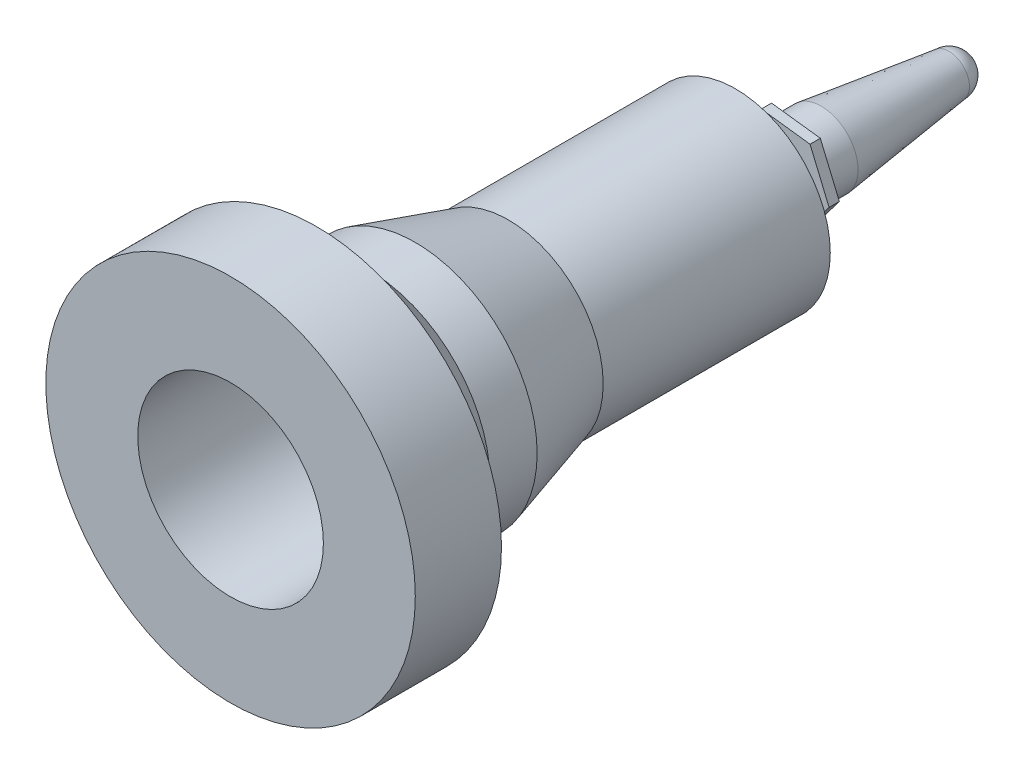
ISO-10303-21;
HEADER;
FILE_DESCRIPTION(('STEP AP214'),'2;1');
FILE_NAME('part.step','',(''),(''),'','','');
FILE_SCHEMA(('AUTOMOTIVE_DESIGN { 1 0 10303 214 1 1 1 1 }'));
ENDSEC;
DATA;
#1=APPLICATION_CONTEXT('core data for automotive mechanical design processes');
#2=APPLICATION_PROTOCOL_DEFINITION('international standard','automotive_design',2000,#1);
#3=PRODUCT_CONTEXT('',#1,'mechanical');
#4=PRODUCT('Part','Part','',(#3));
#5=PRODUCT_RELATED_PRODUCT_CATEGORY('part','',(#4));
#6=PRODUCT_DEFINITION_FORMATION('','',#4);
#7=PRODUCT_DEFINITION_CONTEXT('part definition',#1,'design');
#8=PRODUCT_DEFINITION('design','',#6,#7);
#9=PRODUCT_DEFINITION_SHAPE('','',#8);
#10=(LENGTH_UNIT() NAMED_UNIT(*) SI_UNIT(.MILLI.,.METRE.));
#11=(NAMED_UNIT(*) PLANE_ANGLE_UNIT() SI_UNIT($,.RADIAN.));
#12=(NAMED_UNIT(*) SI_UNIT($,.STERADIAN.) SOLID_ANGLE_UNIT());
#13=UNCERTAINTY_MEASURE_WITH_UNIT(LENGTH_MEASURE(1.E-05),#10,'distance_accuracy_value','');
#14=(GEOMETRIC_REPRESENTATION_CONTEXT(3) GLOBAL_UNCERTAINTY_ASSIGNED_CONTEXT((#13)) GLOBAL_UNIT_ASSIGNED_CONTEXT((#10,
#11,#12)) REPRESENTATION_CONTEXT('',''));
#15=CARTESIAN_POINT('',(0.,0.,0.));
#16=DIRECTION('',(0.,0.,1.));
#17=DIRECTION('',(1.,0.,0.));
#18=AXIS2_PLACEMENT_3D('',#15,#16,#17);
#19=CARTESIAN_POINT('',(0.,0.,0.));
#20=DIRECTION('',(0.,0.,1.));
#21=DIRECTION('',(1.,0.,0.));
#22=AXIS2_PLACEMENT_3D('',#19,#20,#21);
#23=CYLINDRICAL_SURFACE('',#22,118.736948210719);
#24=CARTESIAN_POINT('',(0.,0.,-134.));
#25=DIRECTION('',(0.,0.,1.));
#26=DIRECTION('',(1.,0.,0.));
#27=AXIS2_PLACEMENT_3D('',#24,#25,#26);
#28=CIRCLE('',#27,118.736948210719);
#29=CARTESIAN_POINT('',(118.736948210719,0.,-134.));
#30=VERTEX_POINT('',#29);
#31=EDGE_CURVE('E11',#30,#30,#28,.F.);
#32=ORIENTED_EDGE('',*,*,#31,.T.);
#33=EDGE_LOOP('',(#32));
#34=FACE_BOUND('',#33,.T.);
#35=CARTESIAN_POINT('',(0.,0.,-180.));
#36=DIRECTION('',(0.,0.,1.));
#37=DIRECTION('',(1.,0.,0.));
#38=AXIS2_PLACEMENT_3D('',#35,#36,#37);
#39=CIRCLE('',#38,118.736948210719);
#40=CARTESIAN_POINT('',(118.736948210719,0.,-180.));
#41=VERTEX_POINT('',#40);
#42=EDGE_CURVE('E140',#41,#41,#39,.T.);
#43=ORIENTED_EDGE('',*,*,#42,.T.);
#44=EDGE_LOOP('',(#43));
#45=FACE_BOUND('',#44,.T.);
#46=ADVANCED_FACE('F33',(#34,#45),#23,.T.);
#47=CARTESIAN_POINT('',(0.,0.,-700.));
#48=DIRECTION('',(0.,0.,1.));
#49=DIRECTION('',(0.,1.,0.));
#50=AXIS2_PLACEMENT_3D('',#47,#48,#49);
#51=SPHERICAL_SURFACE('',#50,20.);
#52=CARTESIAN_POINT('',(0.,0.,-700.));
#53=DIRECTION('',(0.,0.,1.));
#54=DIRECTION('',(1.,0.,0.));
#55=AXIS2_PLACEMENT_3D('',#52,#53,#54);
#56=CIRCLE('',#55,20.);
#57=CARTESIAN_POINT('',(20.,0.,-700.));
#58=VERTEX_POINT('',#57);
#59=EDGE_CURVE('E158',#58,#58,#56,.T.);
#60=ORIENTED_EDGE('',*,*,#59,.F.);
#61=EDGE_LOOP('',(#60));
#62=FACE_BOUND('',#61,.T.);
#63=CARTESIAN_POINT('',(0.,0.,-719.536134747038));
#64=DIRECTION('',(0.,0.,1.));
#65=DIRECTION('',(1.,0.,0.));
#66=AXIS2_PLACEMENT_3D('',#63,#64,#65);
#67=CIRCLE('',#66,4.28245713879006);
#68=CARTESIAN_POINT('',(4.28245713879006,0.,-719.536134747038));
#69=VERTEX_POINT('',#68);
#70=EDGE_CURVE('E123',#69,#69,#67,.F.);
#71=ORIENTED_EDGE('',*,*,#70,.F.);
#72=EDGE_LOOP('',(#71));
#73=FACE_BOUND('',#72,.T.);
#74=ADVANCED_FACE('F181',(#62,#73),#51,.T.);
#75=CARTESIAN_POINT('',(0.,0.,0.));
#76=DIRECTION('',(0.,0.,-1.));
#77=DIRECTION('',(-1.,0.,0.));
#78=AXIS2_PLACEMENT_3D('',#75,#76,#77);
#79=PLANE('',#78);
#80=CARTESIAN_POINT('',(0.,0.,0.));
#81=DIRECTION('',(0.,0.,1.));
#82=DIRECTION('',(1.,0.,0.));
#83=AXIS2_PLACEMENT_3D('',#80,#81,#82);
#84=CIRCLE('',#83,90.4479858363972);
#85=CARTESIAN_POINT('',(90.4479858363972,0.,0.));
#86=VERTEX_POINT('',#85);
#87=EDGE_CURVE('E164',#86,#86,#84,.T.);
#88=ORIENTED_EDGE('',*,*,#87,.F.);
#89=EDGE_LOOP('',(#88));
#90=FACE_BOUND('',#89,.T.);
#91=CARTESIAN_POINT('',(0.,0.,0.));
#92=DIRECTION('',(0.,0.,1.));
#93=DIRECTION('',(1.,0.,0.));
#94=AXIS2_PLACEMENT_3D('',#91,#92,#93);
#95=CIRCLE('',#94,180.);
#96=CARTESIAN_POINT('',(180.,0.,0.));
#97=VERTEX_POINT('',#96);
#98=EDGE_CURVE('E229',#97,#97,#95,.T.);
#99=ORIENTED_EDGE('',*,*,#98,.T.);
#100=EDGE_LOOP('',(#99));
#101=FACE_BOUND('',#100,.T.);
#102=ADVANCED_FACE('F187',(#90,#101),#79,.F.);
#103=CARTESIAN_POINT('',(0.,0.,0.));
#104=DIRECTION('',(0.,0.,1.));
#105=DIRECTION('',(1.,0.,0.));
#106=AXIS2_PLACEMENT_3D('',#103,#104,#105);
#107=CYLINDRICAL_SURFACE('',#106,24.);
#108=CARTESIAN_POINT('',(0.,0.,-535.741946393258));
#109=DIRECTION('',(0.,0.,1.));
#110=DIRECTION('',(1.,0.,0.));
#111=AXIS2_PLACEMENT_3D('',#108,#109,#110);
#112=CIRCLE('',#111,24.);
#113=CARTESIAN_POINT('',(24.,0.,-535.741946393258));
#114=VERTEX_POINT('',#113);
#115=EDGE_CURVE('E139',#114,#114,#112,.T.);
#116=ORIENTED_EDGE('',*,*,#115,.T.);
#117=EDGE_LOOP('',(#116));
#118=FACE_BOUND('',#117,.T.);
#119=CARTESIAN_POINT('',(0.,0.,-492.));
#120=DIRECTION('',(0.,0.,1.));
#121=DIRECTION('',(1.,0.,0.));
#122=AXIS2_PLACEMENT_3D('',#119,#120,#121);
#123=CIRCLE('',#122,24.);
#124=CARTESIAN_POINT('',(24.,0.,-492.));
#125=VERTEX_POINT('',#124);
#126=EDGE_CURVE('E149',#125,#125,#123,.T.);
#127=ORIENTED_EDGE('',*,*,#126,.F.);
#128=EDGE_LOOP('',(#127));
#129=FACE_BOUND('',#128,.T.);
#130=ADVANCED_FACE('F206',(#118,#129),#107,.T.);
#131=CARTESIAN_POINT('',(0.,24.,-492.));
#132=DIRECTION('',(0.,0.,1.));
#133=DIRECTION('',(1.,0.,0.));
#134=AXIS2_PLACEMENT_3D('',#131,#132,#133);
#135=PLANE('',#134);
#136=CARTESIAN_POINT('',(0.,0.,-492.));
#137=DIRECTION('',(0.,0.,1.));
#138=DIRECTION('',(1.,0.,0.));
#139=AXIS2_PLACEMENT_3D('',#136,#137,#138);
#140=CIRCLE('',#139,92.3509597194478);
#141=CARTESIAN_POINT('',(92.3509597194478,0.,-492.));
#142=VERTEX_POINT('',#141);
#143=EDGE_CURVE('E146',#142,#142,#140,.T.);
#144=ORIENTED_EDGE('',*,*,#143,.F.);
#145=EDGE_LOOP('',(#144));
#146=FACE_BOUND('',#145,.T.);
#147=ORIENTED_EDGE('',*,*,#126,.T.);
#148=EDGE_LOOP('',(#147));
#149=FACE_BOUND('',#148,.T.);
#150=ADVANCED_FACE('F202',(#146,#149),#135,.F.);
#151=CARTESIAN_POINT('',(0.,0.,0.));
#152=DIRECTION('',(0.,0.,1.));
#153=DIRECTION('',(1.,0.,0.));
#154=AXIS2_PLACEMENT_3D('',#151,#152,#153);
#155=CYLINDRICAL_SURFACE('',#154,92.3509597194478);
#156=CARTESIAN_POINT('',(0.,0.,-270.7367084028));
#157=DIRECTION('',(0.,0.,1.));
#158=DIRECTION('',(1.,0.,0.));
#159=AXIS2_PLACEMENT_3D('',#156,#157,#158);
#160=CIRCLE('',#159,92.3509597194478);
#161=CARTESIAN_POINT('',(92.3509597194478,0.,-270.7367084028));
#162=VERTEX_POINT('',#161);
#163=EDGE_CURVE('E143',#162,#162,#160,.T.);
#164=ORIENTED_EDGE('',*,*,#163,.F.);
#165=EDGE_LOOP('',(#164));
#166=FACE_BOUND('',#165,.T.);
#167=ORIENTED_EDGE('',*,*,#143,.T.);
#168=EDGE_LOOP('',(#167));
#169=FACE_BOUND('',#168,.T.);
#170=ADVANCED_FACE('F198',(#166,#169),#155,.T.);
#171=CARTESIAN_POINT('',(0.,0.,-270.7367084028));
#172=DIRECTION('',(0.,0.,1.));
#173=DIRECTION('',(1.,0.,0.));
#174=AXIS2_PLACEMENT_3D('',#171,#172,#173);
#175=CONICAL_SURFACE('',#174,92.3509597194478,0.282992700339821);
#176=ORIENTED_EDGE('',*,*,#42,.F.);
#177=EDGE_LOOP('',(#176));
#178=FACE_BOUND('',#177,.T.);
#179=ORIENTED_EDGE('',*,*,#163,.T.);
#180=EDGE_LOOP('',(#179));
#181=FACE_BOUND('',#180,.T.);
#182=ADVANCED_FACE('F195',(#178,#181),#175,.T.);
#183=CARTESIAN_POINT('',(18.5811043039227,-44.0761815550295,-535.741946393258));
#184=DIRECTION('',(-0.797149207528996,0.603782362226567,0.));
#185=DIRECTION('',(-0.603782362226567,-0.797149207528996,0.));
#186=AXIS2_PLACEMENT_3D('',#183,#184,#185);
#187=PLANE('',#186);
#188=DIRECTION('',(0.603782362226567,0.797149207528996,0.));
#189=VECTOR('',#188,1.);
#190=CARTESIAN_POINT('',(18.5811043039227,-44.0761815550295,-545.741946393258));
#191=LINE('',#190,#189);
#192=CARTESIAN_POINT('',(18.5811043039227,-44.0761815550295,-545.741946393258));
#193=VERTEX_POINT('',#192);
#194=CARTESIAN_POINT('',(47.4616450804319,-5.9463824199493,-545.741946393258));
#195=VERTEX_POINT('',#194);
#196=EDGE_CURVE('E119',#193,#195,#191,.T.);
#197=ORIENTED_EDGE('',*,*,#196,.T.);
#198=DIRECTION('',(0.,0.,-1.));
#199=VECTOR('',#198,1.);
#200=CARTESIAN_POINT('',(47.4616450804319,-5.9463824199493,-535.741946393258));
#201=LINE('',#200,#199);
#202=CARTESIAN_POINT('',(47.4616450804319,-5.9463824199493,-535.741946393258));
#203=VERTEX_POINT('',#202);
#204=EDGE_CURVE('E137',#203,#195,#201,.T.);
#205=ORIENTED_EDGE('',*,*,#204,.F.);
#206=DIRECTION('',(0.603782362226567,0.797149207528996,0.));
#207=VECTOR('',#206,1.);
#208=CARTESIAN_POINT('',(18.5811043039227,-44.0761815550295,-535.741946393258));
#209=LINE('',#208,#207);
#210=CARTESIAN_POINT('',(18.5811043039227,-44.0761815550295,-535.741946393258));
#211=VERTEX_POINT('',#210);
#212=EDGE_CURVE('E130',#211,#203,#209,.T.);
#213=ORIENTED_EDGE('',*,*,#212,.F.);
#214=DIRECTION('',(0.,0.,-1.));
#215=VECTOR('',#214,1.);
#216=CARTESIAN_POINT('',(18.5811043039227,-44.0761815550295,-535.741946393258));
#217=LINE('',#216,#215);
#218=EDGE_CURVE('E115',#211,#193,#217,.T.);
#219=ORIENTED_EDGE('',*,*,#218,.T.);
#220=EDGE_LOOP('',(#197,#205,#213,#219));
#221=FACE_BOUND('',#220,.T.);
#222=ADVANCED_FACE('F193',(#221),#187,.F.);
#223=CARTESIAN_POINT('',(47.4616450804319,-5.9463824199493,-535.741946393258));
#224=DIRECTION('',(-0.921465467809683,-0.38846028321346,0.));
#225=DIRECTION('',(0.38846028321346,-0.921465467809683,0.));
#226=AXIS2_PLACEMENT_3D('',#223,#224,#225);
#227=PLANE('',#226);
#228=DIRECTION('',(-0.38846028321346,0.921465467809683,0.));
#229=VECTOR('',#228,1.);
#230=CARTESIAN_POINT('',(47.4616450804319,-5.9463824199493,-545.741946393258));
#231=LINE('',#230,#229);
#232=CARTESIAN_POINT('',(28.8805407765093,38.1297991350802,-545.741946393258));
#233=VERTEX_POINT('',#232);
#234=EDGE_CURVE('E122',#195,#233,#231,.T.);
#235=ORIENTED_EDGE('',*,*,#234,.T.);
#236=DIRECTION('',(0.,0.,-1.));
#237=VECTOR('',#236,1.);
#238=CARTESIAN_POINT('',(28.8805407765093,38.1297991350802,-535.741946393258));
#239=LINE('',#238,#237);
#240=CARTESIAN_POINT('',(28.8805407765093,38.1297991350802,-535.741946393258));
#241=VERTEX_POINT('',#240);
#242=EDGE_CURVE('E134',#241,#233,#239,.T.);
#243=ORIENTED_EDGE('',*,*,#242,.F.);
#244=DIRECTION('',(-0.38846028321346,0.921465467809683,0.));
#245=VECTOR('',#244,1.);
#246=CARTESIAN_POINT('',(47.4616450804319,-5.9463824199493,-535.741946393258));
#247=LINE('',#246,#245);
#248=EDGE_CURVE('E88',#203,#241,#247,.T.);
#249=ORIENTED_EDGE('',*,*,#248,.F.);
#250=ORIENTED_EDGE('',*,*,#204,.T.);
#251=EDGE_LOOP('',(#235,#243,#249,#250));
#252=FACE_BOUND('',#251,.T.);
#253=ADVANCED_FACE('F255',(#252),#227,.F.);
#254=CARTESIAN_POINT('',(28.8805407765093,38.1297991350802,-535.741946393258));
#255=DIRECTION('',(-0.124316260280687,-0.992242645440028,0.));
#256=DIRECTION('',(0.992242645440028,-0.124316260280688,0.));
#257=AXIS2_PLACEMENT_3D('',#254,#255,#256);
#258=PLANE('',#257);
#259=DIRECTION('',(-0.992242645440028,0.124316260280687,0.));
#260=VECTOR('',#259,1.);
#261=CARTESIAN_POINT('',(28.8805407765093,38.1297991350802,-545.741946393258));
#262=LINE('',#261,#260);
#263=CARTESIAN_POINT('',(-18.5811043039227,44.0761815550295,-545.741946393258));
#264=VERTEX_POINT('',#263);
#265=EDGE_CURVE('E125',#233,#264,#262,.T.);
#266=ORIENTED_EDGE('',*,*,#265,.T.);
#267=DIRECTION('',(0.,0.,-1.));
#268=VECTOR('',#267,1.);
#269=CARTESIAN_POINT('',(-18.5811043039227,44.0761815550295,-535.741946393258));
#270=LINE('',#269,#268);
#271=CARTESIAN_POINT('',(-18.5811043039227,44.0761815550295,-535.741946393258));
#272=VERTEX_POINT('',#271);
#273=EDGE_CURVE('E110',#272,#264,#270,.T.);
#274=ORIENTED_EDGE('',*,*,#273,.F.);
#275=DIRECTION('',(-0.992242645440028,0.124316260280687,0.));
#276=VECTOR('',#275,1.);
#277=CARTESIAN_POINT('',(28.8805407765093,38.1297991350802,-535.741946393258));
#278=LINE('',#277,#276);
#279=EDGE_CURVE('E101',#241,#272,#278,.T.);
#280=ORIENTED_EDGE('',*,*,#279,.F.);
#281=ORIENTED_EDGE('',*,*,#242,.T.);
#282=EDGE_LOOP('',(#266,#274,#280,#281));
#283=FACE_BOUND('',#282,.T.);
#284=ADVANCED_FACE('F258',(#283),#258,.F.);
#285=CARTESIAN_POINT('',(-18.5811043039227,44.0761815550295,-535.741946393258));
#286=DIRECTION('',(0.797149207528996,-0.603782362226568,0.));
#287=DIRECTION('',(0.603782362226568,0.797149207528996,0.));
#288=AXIS2_PLACEMENT_3D('',#285,#286,#287);
#289=PLANE('',#288);
#290=DIRECTION('',(-0.603782362226568,-0.797149207528996,0.));
#291=VECTOR('',#290,1.);
#292=CARTESIAN_POINT('',(-18.5811043039227,44.0761815550295,-545.741946393258));
#293=LINE('',#292,#291);
#294=CARTESIAN_POINT('',(-47.4616450804319,5.94638241994932,-545.741946393258));
#295=VERTEX_POINT('',#294);
#296=EDGE_CURVE('E109',#264,#295,#293,.T.);
#297=ORIENTED_EDGE('',*,*,#296,.T.);
#298=DIRECTION('',(0.,0.,-1.));
#299=VECTOR('',#298,1.);
#300=CARTESIAN_POINT('',(-47.4616450804319,5.94638241994932,-535.741946393258));
#301=LINE('',#300,#299);
#302=CARTESIAN_POINT('',(-47.4616450804319,5.94638241994932,-535.741946393258));
#303=VERTEX_POINT('',#302);
#304=EDGE_CURVE('E106',#303,#295,#301,.T.);
#305=ORIENTED_EDGE('',*,*,#304,.F.);
#306=DIRECTION('',(-0.603782362226568,-0.797149207528996,0.));
#307=VECTOR('',#306,1.);
#308=CARTESIAN_POINT('',(-18.5811043039227,44.0761815550295,-535.741946393258));
#309=LINE('',#308,#307);
#310=EDGE_CURVE('E95',#272,#303,#309,.T.);
#311=ORIENTED_EDGE('',*,*,#310,.F.);
#312=ORIENTED_EDGE('',*,*,#273,.T.);
#313=EDGE_LOOP('',(#297,#305,#311,#312));
#314=FACE_BOUND('',#313,.T.);
#315=ADVANCED_FACE('F107',(#314),#289,.F.);
#316=CARTESIAN_POINT('',(-47.4616450804319,5.94638241994932,-535.741946393258));
#317=DIRECTION('',(0.921465467809683,0.38846028321346,0.));
#318=DIRECTION('',(-0.38846028321346,0.921465467809683,0.));
#319=AXIS2_PLACEMENT_3D('',#316,#317,#318);
#320=PLANE('',#319);
#321=DIRECTION('',(0.38846028321346,-0.921465467809683,0.));
#322=VECTOR('',#321,1.);
#323=CARTESIAN_POINT('',(-47.4616450804319,5.94638241994932,-545.741946393258));
#324=LINE('',#323,#322);
#325=CARTESIAN_POINT('',(-28.8805407765093,-38.1297991350801,-545.741946393258));
#326=VERTEX_POINT('',#325);
#327=EDGE_CURVE('E73',#295,#326,#324,.T.);
#328=ORIENTED_EDGE('',*,*,#327,.T.);
#329=DIRECTION('',(0.,0.,-1.));
#330=VECTOR('',#329,1.);
#331=CARTESIAN_POINT('',(-28.8805407765093,-38.1297991350801,-535.741946393258));
#332=LINE('',#331,#330);
#333=CARTESIAN_POINT('',(-28.8805407765093,-38.1297991350801,-535.741946393258));
#334=VERTEX_POINT('',#333);
#335=EDGE_CURVE('E111',#334,#326,#332,.T.);
#336=ORIENTED_EDGE('',*,*,#335,.F.);
#337=DIRECTION('',(0.38846028321346,-0.921465467809683,0.));
#338=VECTOR('',#337,1.);
#339=CARTESIAN_POINT('',(-47.4616450804319,5.94638241994932,-535.741946393258));
#340=LINE('',#339,#338);
#341=EDGE_CURVE('E99',#303,#334,#340,.T.);
#342=ORIENTED_EDGE('',*,*,#341,.F.);
#343=ORIENTED_EDGE('',*,*,#304,.T.);
#344=EDGE_LOOP('',(#328,#336,#342,#343));
#345=FACE_BOUND('',#344,.T.);
#346=ADVANCED_FACE('F113',(#345),#320,.F.);
#347=CARTESIAN_POINT('',(-28.8805407765093,-38.1297991350801,-535.741946393258));
#348=DIRECTION('',(0.124316260280688,0.992242645440028,0.));
#349=DIRECTION('',(-0.992242645440028,0.124316260280688,0.));
#350=AXIS2_PLACEMENT_3D('',#347,#348,#349);
#351=PLANE('',#350);
#352=DIRECTION('',(0.992242645440027,-0.124316260280688,0.));
#353=VECTOR('',#352,1.);
#354=CARTESIAN_POINT('',(-28.8805407765093,-38.1297991350801,-545.741946393258));
#355=LINE('',#354,#353);
#356=EDGE_CURVE('E79',#326,#193,#355,.T.);
#357=ORIENTED_EDGE('',*,*,#356,.T.);
#358=ORIENTED_EDGE('',*,*,#218,.F.);
#359=DIRECTION('',(0.992242645440027,-0.124316260280688,0.));
#360=VECTOR('',#359,1.);
#361=CARTESIAN_POINT('',(-28.8805407765093,-38.1297991350801,-535.741946393258));
#362=LINE('',#361,#360);
#363=EDGE_CURVE('E50',#334,#211,#362,.T.);
#364=ORIENTED_EDGE('',*,*,#363,.F.);
#365=ORIENTED_EDGE('',*,*,#335,.T.);
#366=EDGE_LOOP('',(#357,#358,#364,#365));
#367=FACE_BOUND('',#366,.T.);
#368=ADVANCED_FACE('F262',(#367),#351,.F.);
#369=CARTESIAN_POINT('',(0.,0.,-535.741946393258));
#370=DIRECTION('',(0.,0.,1.));
#371=DIRECTION('',(1.,0.,0.));
#372=AXIS2_PLACEMENT_3D('',#369,#370,#371);
#373=PLANE('',#372);
#374=ORIENTED_EDGE('',*,*,#115,.F.);
#375=EDGE_LOOP('',(#374));
#376=FACE_BOUND('',#375,.T.);
#377=ORIENTED_EDGE('',*,*,#212,.T.);
#378=ORIENTED_EDGE('',*,*,#248,.T.);
#379=ORIENTED_EDGE('',*,*,#279,.T.);
#380=ORIENTED_EDGE('',*,*,#310,.T.);
#381=ORIENTED_EDGE('',*,*,#341,.T.);
#382=ORIENTED_EDGE('',*,*,#363,.T.);
#383=EDGE_LOOP('',(#377,#378,#379,#380,#381,#382));
#384=FACE_BOUND('',#383,.T.);
#385=ADVANCED_FACE('F97',(#376,#384),#373,.T.);
#386=CARTESIAN_POINT('',(0.,0.,-545.741946393258));
#387=DIRECTION('',(0.,0.,1.));
#388=DIRECTION('',(1.,0.,0.));
#389=AXIS2_PLACEMENT_3D('',#386,#387,#388);
#390=PLANE('',#389);
#391=CARTESIAN_POINT('',(0.,0.,-545.741946393258));
#392=DIRECTION('',(0.,0.,1.));
#393=DIRECTION('',(1.,0.,0.));
#394=AXIS2_PLACEMENT_3D('',#391,#392,#393);
#395=CIRCLE('',#394,35.8894796090416);
#396=CARTESIAN_POINT('',(35.8894796090416,0.,-545.741946393258));
#397=VERTEX_POINT('',#396);
#398=EDGE_CURVE('E152',#397,#397,#395,.T.);
#399=ORIENTED_EDGE('',*,*,#398,.T.);
#400=EDGE_LOOP('',(#399));
#401=FACE_BOUND('',#400,.T.);
#402=ORIENTED_EDGE('',*,*,#196,.F.);
#403=ORIENTED_EDGE('',*,*,#356,.F.);
#404=ORIENTED_EDGE('',*,*,#327,.F.);
#405=ORIENTED_EDGE('',*,*,#296,.F.);
#406=ORIENTED_EDGE('',*,*,#265,.F.);
#407=ORIENTED_EDGE('',*,*,#234,.F.);
#408=EDGE_LOOP('',(#402,#403,#404,#405,#406,#407));
#409=FACE_BOUND('',#408,.T.);
#410=ADVANCED_FACE('F218',(#401,#409),#390,.F.);
#411=CARTESIAN_POINT('',(0.,0.,-700.));
#412=DIRECTION('',(0.,0.,1.));
#413=DIRECTION('',(1.,0.,0.));
#414=AXIS2_PLACEMENT_3D('',#411,#412,#413);
#415=CONICAL_SURFACE('',#414,20.,0.126950737295993);
#416=CARTESIAN_POINT('',(0.,0.,-575.510554629339));
#417=DIRECTION('',(0.,0.,1.));
#418=DIRECTION('',(1.,0.,0.));
#419=AXIS2_PLACEMENT_3D('',#416,#417,#418);
#420=CIRCLE('',#419,35.8894796090416);
#421=CARTESIAN_POINT('',(35.8894796090416,0.,-575.510554629339));
#422=VERTEX_POINT('',#421);
#423=EDGE_CURVE('E155',#422,#422,#420,.T.);
#424=ORIENTED_EDGE('',*,*,#423,.F.);
#425=EDGE_LOOP('',(#424));
#426=FACE_BOUND('',#425,.T.);
#427=ORIENTED_EDGE('',*,*,#59,.T.);
#428=EDGE_LOOP('',(#427));
#429=FACE_BOUND('',#428,.T.);
#430=ADVANCED_FACE('F215',(#426,#429),#415,.T.);
#431=CARTESIAN_POINT('',(0.,0.,0.));
#432=DIRECTION('',(0.,0.,1.));
#433=DIRECTION('',(1.,0.,0.));
#434=AXIS2_PLACEMENT_3D('',#431,#432,#433);
#435=CYLINDRICAL_SURFACE('',#434,35.8894796090416);
#436=ORIENTED_EDGE('',*,*,#398,.F.);
#437=EDGE_LOOP('',(#436));
#438=FACE_BOUND('',#437,.T.);
#439=ORIENTED_EDGE('',*,*,#423,.T.);
#440=EDGE_LOOP('',(#439));
#441=FACE_BOUND('',#440,.T.);
#442=ADVANCED_FACE('F211',(#438,#441),#435,.T.);
#443=CARTESIAN_POINT('',(0.,0.,-720.));
#444=DIRECTION('',(0.,0.,1.));
#445=DIRECTION('',(1.,0.,0.));
#446=AXIS2_PLACEMENT_3D('',#443,#444,#445);
#447=CONICAL_SURFACE('',#446,4.24350932983724,0.0837671457035132);
#448=CARTESIAN_POINT('',(0.,0.,-575.510554629339));
#449=DIRECTION('',(0.,0.,1.));
#450=DIRECTION('',(1.,0.,0.));
#451=AXIS2_PLACEMENT_3D('',#448,#449,#450);
#452=CIRCLE('',#451,16.3753671873944);
#453=CARTESIAN_POINT('',(16.3753671873944,0.,-575.510554629339));
#454=VERTEX_POINT('',#453);
#455=EDGE_CURVE('E234',#454,#454,#452,.T.);
#456=CARTESIAN_POINT('',(16.3753671873944,0.,-575.510554629339));
#457=CARTESIAN_POINT('',(16.2493993743881,0.,-577.010821088898));
#458=CARTESIAN_POINT('',(16.1234315613818,0.,-578.511087548458));
#459=CARTESIAN_POINT('',(15.8714959353692,0.,-581.511620467576));
#460=CARTESIAN_POINT('',(15.7455281223629,0.,-583.011886927136));
#461=CARTESIAN_POINT('',(15.4935924963504,0.,-586.012419846254));
#462=CARTESIAN_POINT('',(15.3676246833441,0.,-587.512686305814));
#463=CARTESIAN_POINT('',(15.1156890573315,0.,-590.513219224933));
#464=CARTESIAN_POINT('',(14.9897212443252,0.,-592.013485684492));
#465=CARTESIAN_POINT('',(14.7377856183126,0.,-595.014018603611));
#466=CARTESIAN_POINT('',(14.6118178053063,0.,-596.51428506317));
#467=CARTESIAN_POINT('',(14.3598821792937,0.,-599.514817982289));
#468=CARTESIAN_POINT('',(14.2339143662874,0.,-601.015084441848));
#469=CARTESIAN_POINT('',(13.9819787402748,0.,-604.015617360967));
#470=CARTESIAN_POINT('',(13.8560109272685,0.,-605.515883820526));
#471=CARTESIAN_POINT('',(13.6040753012559,0.,-608.516416739645));
#472=CARTESIAN_POINT('',(13.4781074882496,0.,-610.016683199204));
#473=CARTESIAN_POINT('',(13.226171862237,0.,-613.017216118323));
#474=CARTESIAN_POINT('',(13.1002040492307,0.,-614.517482577882));
#475=CARTESIAN_POINT('',(12.8482684232181,0.,-617.518015497001));
#476=CARTESIAN_POINT('',(12.7223006102118,0.,-619.01828195656));
#477=CARTESIAN_POINT('',(12.4703649841993,0.,-622.018814875679));
#478=CARTESIAN_POINT('',(12.344397171193,0.,-623.519081335239));
#479=CARTESIAN_POINT('',(12.0924615451804,0.,-626.519614254357));
#480=CARTESIAN_POINT('',(11.9664937321741,0.,-628.019880713917));
#481=CARTESIAN_POINT('',(11.7145581061615,0.,-631.020413633035));
#482=CARTESIAN_POINT('',(11.5885902931552,0.,-632.520680092595));
#483=CARTESIAN_POINT('',(11.3366546671426,0.,-635.521213011713));
#484=CARTESIAN_POINT('',(11.2106868541363,0.,-637.021479471273));
#485=CARTESIAN_POINT('',(10.9587512281237,0.,-640.022012390392));
#486=CARTESIAN_POINT('',(10.8327834151174,0.,-641.522278849951));
#487=CARTESIAN_POINT('',(10.5808477891048,0.,-644.52281176907));
#488=CARTESIAN_POINT('',(10.4548799760985,0.,-646.023078228629));
#489=CARTESIAN_POINT('',(10.2029443500859,0.,-649.023611147748));
#490=CARTESIAN_POINT('',(10.0769765370796,0.,-650.523877607307));
#491=CARTESIAN_POINT('',(9.82504091106706,0.,-653.524410526426));
#492=CARTESIAN_POINT('',(9.69907309806076,0.,-655.024676985985));
#493=CARTESIAN_POINT('',(9.44713747204817,0.,-658.025209905104));
#494=CARTESIAN_POINT('',(9.32116965904187,0.,-659.525476364663));
#495=CARTESIAN_POINT('',(9.06923403302928,0.,-662.526009283782));
#496=CARTESIAN_POINT('',(8.94326622002299,0.,-664.026275743341));
#497=CARTESIAN_POINT('',(8.6913305940104,0.,-667.02680866246));
#498=CARTESIAN_POINT('',(8.5653627810041,0.,-668.52707512202));
#499=CARTESIAN_POINT('',(8.31342715499151,0.,-671.527608041138));
#500=CARTESIAN_POINT('',(8.18745934198522,0.,-673.027874500698));
#501=CARTESIAN_POINT('',(7.93552371597263,0.,-676.028407419816));
#502=CARTESIAN_POINT('',(7.80955590296633,0.,-677.528673879376));
#503=CARTESIAN_POINT('',(7.55762027695374,0.,-680.529206798494));
#504=CARTESIAN_POINT('',(7.43165246394744,0.,-682.029473258054));
#505=CARTESIAN_POINT('',(7.17971683793485,0.,-685.030006177173));
#506=CARTESIAN_POINT('',(7.05374902492856,0.,-686.530272636732));
#507=CARTESIAN_POINT('',(6.80181339891597,0.,-689.530805555851));
#508=CARTESIAN_POINT('',(6.67584558590967,0.,-691.03107201541));
#509=CARTESIAN_POINT('',(6.42390995989708,0.,-694.031604934529));
#510=CARTESIAN_POINT('',(6.29794214689078,0.,-695.531871394088));
#511=CARTESIAN_POINT('',(6.04600652087819,0.,-698.532404313207));
#512=CARTESIAN_POINT('',(5.9200387078719,0.,-700.032670772766));
#513=CARTESIAN_POINT('',(5.66810308185931,0.,-703.033203691885));
#514=CARTESIAN_POINT('',(5.54213526885301,0.,-704.533470151444));
#515=CARTESIAN_POINT('',(5.29019964284042,0.,-707.534003070563));
#516=CARTESIAN_POINT('',(5.16423182983412,0.,-709.034269530122));
#517=CARTESIAN_POINT('',(4.91229620382153,0.,-712.034802449241));
#518=CARTESIAN_POINT('',(4.78632839081524,0.,-713.5350689088));
#519=CARTESIAN_POINT('',(4.53439276480265,0.,-716.535601827919));
#520=CARTESIAN_POINT('',(4.40842495179635,0.,-718.035868287479));
#521=CARTESIAN_POINT('',(4.28245713879006,0.,-719.536134747038));
#522=B_SPLINE_CURVE_WITH_KNOTS('',3,(#456,#457,#458,#459,#460,#461,#462,#463,#464,#465,#466,
#467,#468,#469,#470,#471,#472,#473,#474,#475,#476,#477,#478,#479,#480,#481,#482,#483,#484,#485,
#486,#487,#488,#489,#490,#491,#492,#493,#494,#495,#496,#497,#498,#499,#500,#501,#502,#503,#504,
#505,#506,#507,#508,#509,#510,#511,#512,#513,#514,#515,#516,#517,#518,#519,#520,#521),
.UNSPECIFIED.,.F.,.F.,(4,2,2,2,2,2,2,2,2,2,2,2,2,2,2,2,2,2,2,2,2,2,2,2,2,2,2,2,2,2,2,2,4),(0.,
4.51663658670159,9.03327317340318,13.5499097601049,18.0665463468065,22.583182933508,
27.0998195202096,31.6164561069112,36.1330926936128,40.6497292803144,45.166365867016,
49.6830024537176,54.1996390404192,58.7162756271208,63.2329122138223,67.749548800524,
72.2661853872256,76.7828219739272,81.2994585606288,85.8160951473304,90.332731734032,
94.8493683207336,99.3660049074352,103.882641494137,108.399278080838,112.91591466754,
117.432551254242,121.949187840943,126.465824427645,130.982461014346,135.499097601048,
140.01573418775,144.532370774451),.UNSPECIFIED.);
#523=EDGE_CURVE('BSEAM214',#454,#69,#522,.T.);
#524=ORIENTED_EDGE('',*,*,#455,.T.);
#525=ORIENTED_EDGE('',*,*,#70,.T.);
#526=ORIENTED_EDGE('',*,*,#523,.T.);
#527=ORIENTED_EDGE('',*,*,#523,.F.);
#528=EDGE_LOOP('',(#524,#526,#525,#527));
#529=FACE_BOUND('',#528,.T.);
#530=ADVANCED_FACE('F214',(#529),#447,.F.);
#531=CARTESIAN_POINT('',(0.,0.,0.));
#532=DIRECTION('',(0.,0.,1.));
#533=DIRECTION('',(1.,0.,0.));
#534=AXIS2_PLACEMENT_3D('',#531,#532,#533);
#535=CYLINDRICAL_SURFACE('',#534,90.4479858363972);
#536=ORIENTED_EDGE('',*,*,#87,.T.);
#537=EDGE_LOOP('',(#536));
#538=FACE_BOUND('',#537,.T.);
#539=CARTESIAN_POINT('',(0.,0.,-179.731042443091));
#540=DIRECTION('',(0.,0.,1.));
#541=DIRECTION('',(1.,0.,0.));
#542=AXIS2_PLACEMENT_3D('',#539,#540,#541);
#543=CIRCLE('',#542,90.4479858363973);
#544=CARTESIAN_POINT('',(90.4479858363973,0.,-179.731042443091));
#545=VERTEX_POINT('',#544);
#546=EDGE_CURVE('E248',#545,#545,#543,.T.);
#547=ORIENTED_EDGE('',*,*,#546,.F.);
#548=EDGE_LOOP('',(#547));
#549=FACE_BOUND('',#548,.T.);
#550=ADVANCED_FACE('F362',(#538,#549),#535,.F.);
#551=CARTESIAN_POINT('',(0.,0.,-270.7367084028));
#552=DIRECTION('',(0.,0.,1.));
#553=DIRECTION('',(1.,0.,0.));
#554=AXIS2_PLACEMENT_3D('',#551,#552,#553);
#555=CONICAL_SURFACE('',#554,69.2454690721239,0.228896991670563);
#556=ORIENTED_EDGE('',*,*,#546,.T.);
#557=EDGE_LOOP('',(#556));
#558=FACE_BOUND('',#557,.T.);
#559=CARTESIAN_POINT('',(0.,0.,-270.7367084028));
#560=DIRECTION('',(0.,0.,1.));
#561=DIRECTION('',(1.,0.,0.));
#562=AXIS2_PLACEMENT_3D('',#559,#560,#561);
#563=CIRCLE('',#562,69.2454690721239);
#564=CARTESIAN_POINT('',(69.2454690721239,0.,-270.7367084028));
#565=VERTEX_POINT('',#564);
#566=EDGE_CURVE('E245',#565,#565,#563,.T.);
#567=ORIENTED_EDGE('',*,*,#566,.F.);
#568=EDGE_LOOP('',(#567));
#569=FACE_BOUND('',#568,.T.);
#570=ADVANCED_FACE('F372',(#558,#569),#555,.F.);
#571=CARTESIAN_POINT('',(0.,0.,0.));
#572=DIRECTION('',(0.,0.,1.));
#573=DIRECTION('',(1.,0.,0.));
#574=AXIS2_PLACEMENT_3D('',#571,#572,#573);
#575=CYLINDRICAL_SURFACE('',#574,69.2454690721239);
#576=ORIENTED_EDGE('',*,*,#566,.T.);
#577=EDGE_LOOP('',(#576));
#578=FACE_BOUND('',#577,.T.);
#579=CARTESIAN_POINT('',(0.,0.,-416.651810859042));
#580=DIRECTION('',(0.,0.,1.));
#581=DIRECTION('',(1.,0.,0.));
#582=AXIS2_PLACEMENT_3D('',#579,#580,#581);
#583=CIRCLE('',#582,69.2454690721239);
#584=CARTESIAN_POINT('',(69.2454690721238,0.,-416.651810859042));
#585=VERTEX_POINT('',#584);
#586=EDGE_CURVE('E242',#585,#585,#583,.T.);
#587=ORIENTED_EDGE('',*,*,#586,.F.);
#588=EDGE_LOOP('',(#587));
#589=FACE_BOUND('',#588,.T.);
#590=ADVANCED_FACE('F381',(#578,#589),#575,.F.);
#591=CARTESIAN_POINT('',(0.,0.,-477.848045129426));
#592=DIRECTION('',(0.,0.,1.));
#593=DIRECTION('',(1.,0.,0.));
#594=AXIS2_PLACEMENT_3D('',#591,#592,#593);
#595=CONICAL_SURFACE('',#594,16.3753671873944,0.712533615484933);
#596=CARTESIAN_POINT('',(0.,0.,-477.848045129426));
#597=DIRECTION('',(0.,0.,1.));
#598=DIRECTION('',(1.,0.,0.));
#599=AXIS2_PLACEMENT_3D('',#596,#597,#598);
#600=CIRCLE('',#599,16.3753671873944);
#601=CARTESIAN_POINT('',(16.3753671873944,0.,-477.848045129426));
#602=VERTEX_POINT('',#601);
#603=EDGE_CURVE('E239',#602,#602,#600,.T.);
#604=CARTESIAN_POINT('',(69.2454690721238,0.,-416.651810859042));
#605=CARTESIAN_POINT('',(68.6947388441579,0.,-417.289271632692));
#606=CARTESIAN_POINT('',(68.144008616192,0.,-417.926732406342));
#607=CARTESIAN_POINT('',(67.0425481602601,0.,-419.201653953642));
#608=CARTESIAN_POINT('',(66.4918179322942,0.,-419.839114727292));
#609=CARTESIAN_POINT('',(65.3903574763623,0.,-421.114036274591));
#610=CARTESIAN_POINT('',(64.8396272483964,0.,-421.751497048241));
#611=CARTESIAN_POINT('',(63.7381667924645,0.,-423.026418595541));
#612=CARTESIAN_POINT('',(63.1874365644986,0.,-423.663879369191));
#613=CARTESIAN_POINT('',(62.0859761085667,0.,-424.93880091649));
#614=CARTESIAN_POINT('',(61.5352458806008,0.,-425.57626169014));
#615=CARTESIAN_POINT('',(60.4337854246689,0.,-426.85118323744));
#616=CARTESIAN_POINT('',(59.883055196703,0.,-427.48864401109));
#617=CARTESIAN_POINT('',(58.7815947407711,0.,-428.763565558389));
#618=CARTESIAN_POINT('',(58.2308645128052,0.,-429.401026332039));
#619=CARTESIAN_POINT('',(57.1294040568733,0.,-430.675947879339));
#620=CARTESIAN_POINT('',(56.5786738289074,0.,-431.313408652989));
#621=CARTESIAN_POINT('',(55.4772133729755,0.,-432.588330200288));
#622=CARTESIAN_POINT('',(54.9264831450096,0.,-433.225790973938));
#623=CARTESIAN_POINT('',(53.8250226890778,0.,-434.500712521238));
#624=CARTESIAN_POINT('',(53.2742924611118,0.,-435.138173294888));
#625=CARTESIAN_POINT('',(52.17283200518,0.,-436.413094842187));
#626=CARTESIAN_POINT('',(51.622101777214,0.,-437.050555615837));
#627=CARTESIAN_POINT('',(50.5206413212822,0.,-438.325477163137));
#628=CARTESIAN_POINT('',(49.9699110933162,0.,-438.962937936787));
#629=CARTESIAN_POINT('',(48.8684506373844,0.,-440.237859484086));
#630=CARTESIAN_POINT('',(48.3177204094184,0.,-440.875320257736));
#631=CARTESIAN_POINT('',(47.2162599534866,0.,-442.150241805036));
#632=CARTESIAN_POINT('',(46.6655297255206,0.,-442.787702578686));
#633=CARTESIAN_POINT('',(45.5640692695888,0.,-444.062624125985));
#634=CARTESIAN_POINT('',(45.0133390416228,0.,-444.700084899635));
#635=CARTESIAN_POINT('',(43.911878585691,0.,-445.975006446935));
#636=CARTESIAN_POINT('',(43.361148357725,0.,-446.612467220585));
#637=CARTESIAN_POINT('',(42.2596879017932,0.,-447.887388767884));
#638=CARTESIAN_POINT('',(41.7089576738273,0.,-448.524849541534));
#639=CARTESIAN_POINT('',(40.6074972178954,0.,-449.799771088834));
#640=CARTESIAN_POINT('',(40.0567669899295,0.,-450.437231862484));
#641=CARTESIAN_POINT('',(38.9553065339976,0.,-451.712153409783));
#642=CARTESIAN_POINT('',(38.4045763060317,0.,-452.349614183433));
#643=CARTESIAN_POINT('',(37.3031158500998,0.,-453.624535730733));
#644=CARTESIAN_POINT('',(36.7523856221339,0.,-454.261996504383));
#645=CARTESIAN_POINT('',(35.650925166202,0.,-455.536918051682));
#646=CARTESIAN_POINT('',(35.1001949382361,0.,-456.174378825332));
#647=CARTESIAN_POINT('',(33.9987344823042,0.,-457.449300372632));
#648=CARTESIAN_POINT('',(33.4480042543383,0.,-458.086761146282));
#649=CARTESIAN_POINT('',(32.3465437984064,0.,-459.361682693581));
#650=CARTESIAN_POINT('',(31.7958135704405,0.,-459.999143467231));
#651=CARTESIAN_POINT('',(30.6943531145086,0.,-461.274065014531));
#652=CARTESIAN_POINT('',(30.1436228865427,0.,-461.91152578818));
#653=CARTESIAN_POINT('',(29.0421624306108,0.,-463.18644733548));
#654=CARTESIAN_POINT('',(28.4914322026449,0.,-463.82390810913));
#655=CARTESIAN_POINT('',(27.389971746713,0.,-465.09882965643));
#656=CARTESIAN_POINT('',(26.8392415187471,0.,-465.736290430079));
#657=CARTESIAN_POINT('',(25.7377810628152,0.,-467.011211977379));
#658=CARTESIAN_POINT('',(25.1870508348493,0.,-467.648672751029));
#659=CARTESIAN_POINT('',(24.0855903789174,0.,-468.923594298329));
#660=CARTESIAN_POINT('',(23.5348601509515,0.,-469.561055071979));
#661=CARTESIAN_POINT('',(22.4333996950196,0.,-470.835976619278));
#662=CARTESIAN_POINT('',(21.8826694670537,0.,-471.473437392928));
#663=CARTESIAN_POINT('',(20.7812090111218,0.,-472.748358940228));
#664=CARTESIAN_POINT('',(20.2304787831559,0.,-473.385819713877));
#665=CARTESIAN_POINT('',(19.1290183272241,0.,-474.660741261177));
#666=CARTESIAN_POINT('',(18.5782880992581,0.,-475.298202034827));
#667=CARTESIAN_POINT('',(17.4768276433263,0.,-476.573123582127));
#668=CARTESIAN_POINT('',(16.9260974153603,0.,-477.210584355776));
#669=CARTESIAN_POINT('',(16.3753671873944,0.,-477.848045129426));
#670=B_SPLINE_CURVE_WITH_KNOTS('',3,(#604,#605,#606,#607,#608,#609,#610,#611,#612,#613,#614,
#615,#616,#617,#618,#619,#620,#621,#622,#623,#624,#625,#626,#627,#628,#629,#630,#631,#632,#633,
#634,#635,#636,#637,#638,#639,#640,#641,#642,#643,#644,#645,#646,#647,#648,#649,#650,#651,#652,
#653,#654,#655,#656,#657,#658,#659,#660,#661,#662,#663,#664,#665,#666,#667,#668,#669),
.UNSPECIFIED.,.F.,.F.,(4,2,2,2,2,2,2,2,2,2,2,2,2,2,2,2,2,2,2,2,2,2,2,2,2,2,2,2,2,2,2,2,4),(0.,
2.52723963989152,5.05447927978299,7.58171891967446,10.108958559566,12.6361981994574,
15.1634378393489,17.6906774792404,20.2179171191319,22.7451567590234,25.2723963989149,
27.7996360388063,30.3268756786978,32.8541153185893,35.3813549584808,37.9085945983723,
40.4358342382637,42.9630738781552,45.4903135180467,48.0175531579382,50.5447927978297,
53.0720324377212,55.5992720776126,58.1265117175041,60.6537513573956,63.1809909972871,
65.7082306371786,68.23547027707,70.7627099169616,73.289949556853,75.8171891967445,
78.344428836636,80.8716684765275),.UNSPECIFIED.);
#671=EDGE_CURVE('BSEAM390',#585,#602,#670,.T.);
#672=ORIENTED_EDGE('',*,*,#586,.T.);
#673=ORIENTED_EDGE('',*,*,#603,.F.);
#674=ORIENTED_EDGE('',*,*,#671,.T.);
#675=ORIENTED_EDGE('',*,*,#671,.F.);
#676=EDGE_LOOP('',(#672,#674,#673,#675));
#677=FACE_BOUND('',#676,.T.);
#678=ADVANCED_FACE('F390',(#677),#595,.F.);
#679=CARTESIAN_POINT('',(0.,0.,0.));
#680=DIRECTION('',(0.,0.,1.));
#681=DIRECTION('',(1.,0.,0.));
#682=AXIS2_PLACEMENT_3D('',#679,#680,#681);
#683=CYLINDRICAL_SURFACE('',#682,16.3753671873944);
#684=ORIENTED_EDGE('',*,*,#603,.T.);
#685=EDGE_LOOP('',(#684));
#686=FACE_BOUND('',#685,.T.);
#687=ORIENTED_EDGE('',*,*,#455,.F.);
#688=EDGE_LOOP('',(#687));
#689=FACE_BOUND('',#688,.T.);
#690=ADVANCED_FACE('F399',(#686,#689),#683,.F.);
#691=CARTESIAN_POINT('',(0.,0.,-84.));
#692=DIRECTION('',(0.,0.,1.));
#693=DIRECTION('',(1.,0.,0.));
#694=AXIS2_PLACEMENT_3D('',#691,#692,#693);
#695=PLANE('',#694);
#696=CARTESIAN_POINT('',(0.,0.,-84.));
#697=DIRECTION('',(0.,0.,1.));
#698=DIRECTION('',(1.,0.,0.));
#699=AXIS2_PLACEMENT_3D('',#696,#697,#698);
#700=CIRCLE('',#699,168.736948210719);
#701=CARTESIAN_POINT('',(168.736948210719,0.,-84.));
#702=VERTEX_POINT('',#701);
#703=EDGE_CURVE('E42',#702,#702,#700,.T.);
#704=ORIENTED_EDGE('',*,*,#703,.T.);
#705=EDGE_LOOP('',(#704));
#706=FACE_BOUND('',#705,.T.);
#707=CARTESIAN_POINT('',(0.,0.,-84.));
#708=DIRECTION('',(0.,0.,1.));
#709=DIRECTION('',(1.,0.,0.));
#710=AXIS2_PLACEMENT_3D('',#707,#708,#709);
#711=CIRCLE('',#710,180.);
#712=CARTESIAN_POINT('',(180.,0.,-84.));
#713=VERTEX_POINT('',#712);
#714=EDGE_CURVE('E231',#713,#713,#711,.T.);
#715=ORIENTED_EDGE('',*,*,#714,.F.);
#716=EDGE_LOOP('',(#715));
#717=FACE_BOUND('',#716,.T.);
#718=ADVANCED_FACE('F168',(#706,#717),#695,.F.);
#719=CARTESIAN_POINT('',(0.,0.,-84.));
#720=DIRECTION('',(0.,0.,1.));
#721=DIRECTION('',(1.,0.,0.));
#722=AXIS2_PLACEMENT_3D('',#719,#720,#721);
#723=CYLINDRICAL_SURFACE('',#722,180.);
#724=ORIENTED_EDGE('',*,*,#714,.T.);
#725=EDGE_LOOP('',(#724));
#726=FACE_BOUND('',#725,.T.);
#727=ORIENTED_EDGE('',*,*,#98,.F.);
#728=EDGE_LOOP('',(#727));
#729=FACE_BOUND('',#728,.T.);
#730=ADVANCED_FACE('F172',(#726,#729),#723,.T.);
#731=CARTESIAN_POINT('',(0.,0.,-84.));
#732=DIRECTION('',(0.,0.,1.));
#733=DIRECTION('',(1.,0.,0.));
#734=AXIS2_PLACEMENT_3D('',#731,#732,#733);
#735=CONICAL_SURFACE('',#734,168.736948210719,0.785398163397454);
#736=ORIENTED_EDGE('',*,*,#31,.F.);
#737=EDGE_LOOP('',(#736));
#738=FACE_BOUND('',#737,.T.);
#739=ORIENTED_EDGE('',*,*,#703,.F.);
#740=EDGE_LOOP('',(#739));
#741=FACE_BOUND('',#740,.T.);
#742=ADVANCED_FACE('F35',(#738,#741),#735,.T.);
#743=CLOSED_SHELL('',(#46,#74,#102,#130,#150,#170,#182,#222,#253,#284,#315,#346,#368,#385,#410,
#430,#442,#530,#550,#570,#590,#678,#690,#718,#730,#742));
#744=MANIFOLD_SOLID_BREP('B2',#743);
#745=ADVANCED_BREP_SHAPE_REPRESENTATION('',(#18,#744),#14);
#746=SHAPE_DEFINITION_REPRESENTATION(#9,#745);
ENDSEC;
END-ISO-10303-21;
